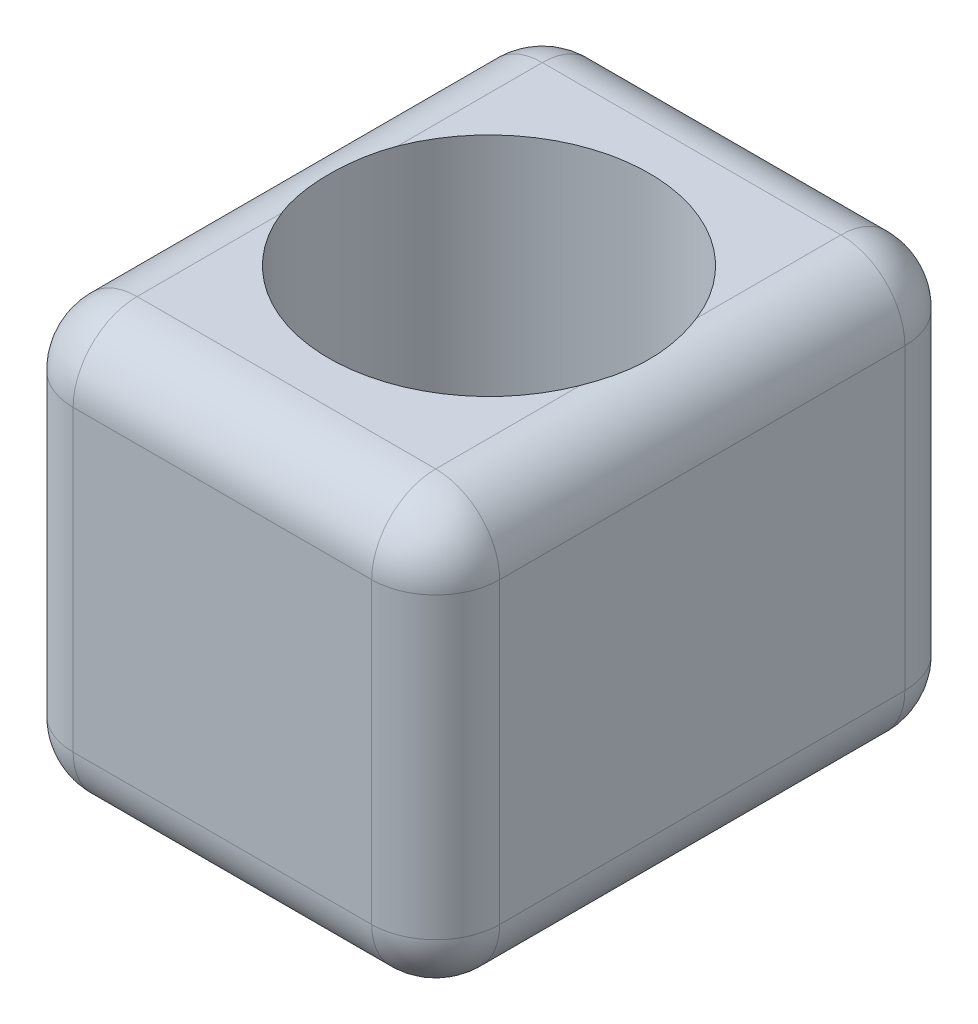
ISO-10303-21;
HEADER;
FILE_DESCRIPTION(('STEP AP214'),'2;1');
FILE_NAME('part.step','',(''),(''),'','','');
FILE_SCHEMA(('AUTOMOTIVE_DESIGN { 1 0 10303 214 1 1 1 1 }'));
ENDSEC;
DATA;
#1=APPLICATION_CONTEXT('core data for automotive mechanical design processes');
#2=APPLICATION_PROTOCOL_DEFINITION('international standard','automotive_design',2000,#1);
#3=PRODUCT_CONTEXT('',#1,'mechanical');
#4=PRODUCT('Part','Part','',(#3));
#5=PRODUCT_RELATED_PRODUCT_CATEGORY('part','',(#4));
#6=PRODUCT_DEFINITION_FORMATION('','',#4);
#7=PRODUCT_DEFINITION_CONTEXT('part definition',#1,'design');
#8=PRODUCT_DEFINITION('design','',#6,#7);
#9=PRODUCT_DEFINITION_SHAPE('','',#8);
#10=(LENGTH_UNIT() NAMED_UNIT(*) SI_UNIT(.MILLI.,.METRE.));
#11=(NAMED_UNIT(*) PLANE_ANGLE_UNIT() SI_UNIT($,.RADIAN.));
#12=(NAMED_UNIT(*) SI_UNIT($,.STERADIAN.) SOLID_ANGLE_UNIT());
#13=UNCERTAINTY_MEASURE_WITH_UNIT(LENGTH_MEASURE(1.E-05),#10,'distance_accuracy_value','');
#14=(GEOMETRIC_REPRESENTATION_CONTEXT(3) GLOBAL_UNCERTAINTY_ASSIGNED_CONTEXT((#13)) GLOBAL_UNIT_ASSIGNED_CONTEXT((#10,
#11,#12)) REPRESENTATION_CONTEXT('',''));
#15=CARTESIAN_POINT('',(0.,0.,0.));
#16=DIRECTION('',(0.,0.,1.));
#17=DIRECTION('',(1.,0.,0.));
#18=AXIS2_PLACEMENT_3D('',#15,#16,#17);
#19=CARTESIAN_POINT('',(-20.,20.,50.));
#20=DIRECTION('',(0.,-1.,0.));
#21=DIRECTION('',(0.,0.,-1.));
#22=AXIS2_PLACEMENT_3D('',#19,#20,#21);
#23=PLANE('',#22);
#24=DIRECTION('',(0.,0.,-1.));
#25=VECTOR('',#24,1.);
#26=CARTESIAN_POINT('',(14.,20.,50.));
#27=LINE('',#26,#25);
#28=CARTESIAN_POINT('',(14.,20.,44.));
#29=VERTEX_POINT('',#28);
#30=CARTESIAN_POINT('',(14.,20.,30.454413350673));
#31=VERTEX_POINT('',#30);
#32=EDGE_CURVE('E46',#29,#31,#27,.T.);
#33=ORIENTED_EDGE('',*,*,#32,.T.);
#34=CARTESIAN_POINT('',(0.,20.,25.));
#35=DIRECTION('',(0.,1.,0.));
#36=DIRECTION('',(0.,0.,1.));
#37=AXIS2_PLACEMENT_3D('',#34,#35,#36);
#38=CIRCLE('',#37,15.025);
#39=CARTESIAN_POINT('',(-14.,20.,30.454413350673));
#40=VERTEX_POINT('',#39);
#41=EDGE_CURVE('E148',#40,#31,#38,.T.);
#42=ORIENTED_EDGE('',*,*,#41,.F.);
#43=DIRECTION('',(0.,0.,-1.));
#44=VECTOR('',#43,1.);
#45=CARTESIAN_POINT('',(-14.,20.,50.));
#46=LINE('',#45,#44);
#47=CARTESIAN_POINT('',(-14.,20.,44.));
#48=VERTEX_POINT('',#47);
#49=EDGE_CURVE('E299',#40,#48,#46,.F.);
#50=ORIENTED_EDGE('',*,*,#49,.T.);
#51=DIRECTION('',(-1.,0.,0.));
#52=VECTOR('',#51,1.);
#53=CARTESIAN_POINT('',(20.,20.,44.));
#54=LINE('',#53,#52);
#55=EDGE_CURVE('E167',#48,#29,#54,.F.);
#56=ORIENTED_EDGE('',*,*,#55,.T.);
#57=EDGE_LOOP('',(#33,#42,#50,#56));
#58=FACE_BOUND('',#57,.T.);
#59=ADVANCED_FACE('F32',(#58),#23,.F.);
#60=CARTESIAN_POINT('',(-20.,-20.,50.));
#61=DIRECTION('',(0.,1.,0.));
#62=DIRECTION('',(0.,0.,1.));
#63=AXIS2_PLACEMENT_3D('',#60,#61,#62);
#64=PLANE('',#63);
#65=DIRECTION('',(0.,0.,-1.));
#66=VECTOR('',#65,1.);
#67=CARTESIAN_POINT('',(14.,-20.,50.));
#68=LINE('',#67,#66);
#69=CARTESIAN_POINT('',(14.,-20.,6.));
#70=VERTEX_POINT('',#69);
#71=CARTESIAN_POINT('',(14.,-20.,19.545586649327));
#72=VERTEX_POINT('',#71);
#73=EDGE_CURVE('E289',#70,#72,#68,.F.);
#74=ORIENTED_EDGE('',*,*,#73,.T.);
#75=CARTESIAN_POINT('',(0.,-20.,25.));
#76=DIRECTION('',(0.,1.,0.));
#77=DIRECTION('',(0.,0.,1.));
#78=AXIS2_PLACEMENT_3D('',#75,#76,#77);
#79=CIRCLE('',#78,15.025);
#80=CARTESIAN_POINT('',(-14.,-20.,19.545586649327));
#81=VERTEX_POINT('',#80);
#82=EDGE_CURVE('E387',#72,#81,#79,.T.);
#83=ORIENTED_EDGE('',*,*,#82,.T.);
#84=DIRECTION('',(0.,0.,-1.));
#85=VECTOR('',#84,1.);
#86=CARTESIAN_POINT('',(-14.,-20.,50.));
#87=LINE('',#86,#85);
#88=CARTESIAN_POINT('',(-14.,-20.,6.));
#89=VERTEX_POINT('',#88);
#90=EDGE_CURVE('E294',#81,#89,#87,.T.);
#91=ORIENTED_EDGE('',*,*,#90,.T.);
#92=DIRECTION('',(1.,0.,0.));
#93=VECTOR('',#92,1.);
#94=CARTESIAN_POINT('',(-20.,-20.,6.));
#95=LINE('',#94,#93);
#96=EDGE_CURVE('E286',#89,#70,#95,.T.);
#97=ORIENTED_EDGE('',*,*,#96,.T.);
#98=EDGE_LOOP('',(#74,#83,#91,#97));
#99=FACE_BOUND('',#98,.T.);
#100=ADVANCED_FACE('F416',(#99),#64,.F.);
#101=CARTESIAN_POINT('',(20.,20.,50.));
#102=DIRECTION('',(-1.,0.,0.));
#103=DIRECTION('',(0.,-1.,0.));
#104=AXIS2_PLACEMENT_3D('',#101,#102,#103);
#105=PLANE('',#104);
#106=DIRECTION('',(0.,1.,0.));
#107=VECTOR('',#106,1.);
#108=CARTESIAN_POINT('',(20.,-20.,44.));
#109=LINE('',#108,#107);
#110=CARTESIAN_POINT('',(20.,14.,44.));
#111=VERTEX_POINT('',#110);
#112=CARTESIAN_POINT('',(20.,-14.,44.));
#113=VERTEX_POINT('',#112);
#114=EDGE_CURVE('E270',#111,#113,#109,.F.);
#115=ORIENTED_EDGE('',*,*,#114,.T.);
#116=DIRECTION('',(0.,0.,-1.));
#117=VECTOR('',#116,1.);
#118=CARTESIAN_POINT('',(20.,-14.,50.));
#119=LINE('',#118,#117);
#120=CARTESIAN_POINT('',(20.,-14.,6.));
#121=VERTEX_POINT('',#120);
#122=EDGE_CURVE('E275',#113,#121,#119,.T.);
#123=ORIENTED_EDGE('',*,*,#122,.T.);
#124=DIRECTION('',(0.,1.,0.));
#125=VECTOR('',#124,1.);
#126=CARTESIAN_POINT('',(20.,20.,6.));
#127=LINE('',#126,#125);
#128=CARTESIAN_POINT('',(20.,14.,6.));
#129=VERTEX_POINT('',#128);
#130=EDGE_CURVE('E272',#121,#129,#127,.T.);
#131=ORIENTED_EDGE('',*,*,#130,.T.);
#132=DIRECTION('',(0.,0.,-1.));
#133=VECTOR('',#132,1.);
#134=CARTESIAN_POINT('',(20.,14.,50.));
#135=LINE('',#134,#133);
#136=EDGE_CURVE('E268',#129,#111,#135,.F.);
#137=ORIENTED_EDGE('',*,*,#136,.T.);
#138=EDGE_LOOP('',(#115,#123,#131,#137));
#139=FACE_BOUND('',#138,.T.);
#140=ADVANCED_FACE('F358',(#139),#105,.F.);
#141=CARTESIAN_POINT('',(-14.,20.,6.));
#142=VERTEX_POINT('',#141);
#143=CARTESIAN_POINT('',(-14.,20.,19.545586649327));
#144=VERTEX_POINT('',#143);
#145=EDGE_CURVE('E300',#142,#144,#46,.F.);
#146=ORIENTED_EDGE('',*,*,#145,.T.);
#147=CARTESIAN_POINT('',(14.,20.,19.545586649327));
#148=VERTEX_POINT('',#147);
#149=EDGE_CURVE('E53',#148,#144,#38,.T.);
#150=ORIENTED_EDGE('',*,*,#149,.F.);
#151=CARTESIAN_POINT('',(14.,20.,6.));
#152=VERTEX_POINT('',#151);
#153=EDGE_CURVE('E163',#148,#152,#27,.T.);
#154=ORIENTED_EDGE('',*,*,#153,.T.);
#155=DIRECTION('',(-1.,0.,0.));
#156=VECTOR('',#155,1.);
#157=CARTESIAN_POINT('',(-20.,20.,6.));
#158=LINE('',#157,#156);
#159=EDGE_CURVE('E298',#152,#142,#158,.T.);
#160=ORIENTED_EDGE('',*,*,#159,.T.);
#161=EDGE_LOOP('',(#146,#150,#154,#160));
#162=FACE_BOUND('',#161,.T.);
#163=ADVANCED_FACE('F386',(#162),#23,.F.);
#164=CARTESIAN_POINT('',(-20.,20.,50.));
#165=DIRECTION('',(1.,0.,0.));
#166=DIRECTION('',(0.,1.,0.));
#167=AXIS2_PLACEMENT_3D('',#164,#165,#166);
#168=PLANE('',#167);
#169=DIRECTION('',(0.,-1.,0.));
#170=VECTOR('',#169,1.);
#171=CARTESIAN_POINT('',(-20.,20.,6.));
#172=LINE('',#171,#170);
#173=CARTESIAN_POINT('',(-20.,14.,6.));
#174=VERTEX_POINT('',#173);
#175=CARTESIAN_POINT('',(-20.,-14.,6.));
#176=VERTEX_POINT('',#175);
#177=EDGE_CURVE('E247',#174,#176,#172,.T.);
#178=ORIENTED_EDGE('',*,*,#177,.T.);
#179=DIRECTION('',(0.,0.,-1.));
#180=VECTOR('',#179,1.);
#181=CARTESIAN_POINT('',(-20.,-14.,50.));
#182=LINE('',#181,#180);
#183=CARTESIAN_POINT('',(-20.,-14.,44.));
#184=VERTEX_POINT('',#183);
#185=EDGE_CURVE('E257',#176,#184,#182,.F.);
#186=ORIENTED_EDGE('',*,*,#185,.T.);
#187=DIRECTION('',(0.,-1.,0.));
#188=VECTOR('',#187,1.);
#189=CARTESIAN_POINT('',(-20.,20.,44.));
#190=LINE('',#189,#188);
#191=CARTESIAN_POINT('',(-20.,14.,44.));
#192=VERTEX_POINT('',#191);
#193=EDGE_CURVE('E241',#184,#192,#190,.F.);
#194=ORIENTED_EDGE('',*,*,#193,.T.);
#195=DIRECTION('',(0.,0.,-1.));
#196=VECTOR('',#195,1.);
#197=CARTESIAN_POINT('',(-20.,14.,50.));
#198=LINE('',#197,#196);
#199=EDGE_CURVE('E236',#192,#174,#198,.T.);
#200=ORIENTED_EDGE('',*,*,#199,.T.);
#201=EDGE_LOOP('',(#178,#186,#194,#200));
#202=FACE_BOUND('',#201,.T.);
#203=ADVANCED_FACE('F324',(#202),#168,.F.);
#204=CARTESIAN_POINT('',(-14.,-20.,44.));
#205=VERTEX_POINT('',#204);
#206=CARTESIAN_POINT('',(-14.,-20.,30.454413350673));
#207=VERTEX_POINT('',#206);
#208=EDGE_CURVE('E295',#205,#207,#87,.T.);
#209=ORIENTED_EDGE('',*,*,#208,.T.);
#210=CARTESIAN_POINT('',(14.,-20.,30.454413350673));
#211=VERTEX_POINT('',#210);
#212=EDGE_CURVE('E60',#207,#211,#79,.T.);
#213=ORIENTED_EDGE('',*,*,#212,.T.);
#214=CARTESIAN_POINT('',(14.,-20.,44.));
#215=VERTEX_POINT('',#214);
#216=EDGE_CURVE('E288',#211,#215,#68,.F.);
#217=ORIENTED_EDGE('',*,*,#216,.T.);
#218=DIRECTION('',(1.,0.,0.));
#219=VECTOR('',#218,1.);
#220=CARTESIAN_POINT('',(-20.,-20.,44.));
#221=LINE('',#220,#219);
#222=EDGE_CURVE('E292',#215,#205,#221,.F.);
#223=ORIENTED_EDGE('',*,*,#222,.T.);
#224=EDGE_LOOP('',(#209,#213,#217,#223));
#225=FACE_BOUND('',#224,.T.);
#226=ADVANCED_FACE('F342',(#225),#64,.F.);
#227=CARTESIAN_POINT('',(0.,0.,50.));
#228=DIRECTION('',(0.,0.,1.));
#229=DIRECTION('',(1.,0.,0.));
#230=AXIS2_PLACEMENT_3D('',#227,#228,#229);
#231=PLANE('',#230);
#232=DIRECTION('',(0.,-1.,0.));
#233=VECTOR('',#232,1.);
#234=CARTESIAN_POINT('',(-14.,-20.,50.));
#235=LINE('',#234,#233);
#236=CARTESIAN_POINT('',(-14.,14.,50.));
#237=VERTEX_POINT('',#236);
#238=CARTESIAN_POINT('',(-14.,-14.,50.));
#239=VERTEX_POINT('',#238);
#240=EDGE_CURVE('E281',#237,#239,#235,.T.);
#241=ORIENTED_EDGE('',*,*,#240,.T.);
#242=DIRECTION('',(1.,0.,0.));
#243=VECTOR('',#242,1.);
#244=CARTESIAN_POINT('',(20.,-14.,50.));
#245=LINE('',#244,#243);
#246=CARTESIAN_POINT('',(14.,-14.,50.));
#247=VERTEX_POINT('',#246);
#248=EDGE_CURVE('E284',#239,#247,#245,.T.);
#249=ORIENTED_EDGE('',*,*,#248,.T.);
#250=DIRECTION('',(0.,1.,0.));
#251=VECTOR('',#250,1.);
#252=CARTESIAN_POINT('',(14.,20.,50.));
#253=LINE('',#252,#251);
#254=CARTESIAN_POINT('',(14.,14.,50.));
#255=VERTEX_POINT('',#254);
#256=EDGE_CURVE('E279',#247,#255,#253,.T.);
#257=ORIENTED_EDGE('',*,*,#256,.T.);
#258=DIRECTION('',(-1.,0.,0.));
#259=VECTOR('',#258,1.);
#260=CARTESIAN_POINT('',(-20.,14.,50.));
#261=LINE('',#260,#259);
#262=EDGE_CURVE('E277',#255,#237,#261,.T.);
#263=ORIENTED_EDGE('',*,*,#262,.T.);
#264=EDGE_LOOP('',(#241,#249,#257,#263));
#265=FACE_BOUND('',#264,.T.);
#266=ADVANCED_FACE('F350',(#265),#231,.T.);
#267=CARTESIAN_POINT('',(0.,0.,0.));
#268=DIRECTION('',(0.,0.,1.));
#269=DIRECTION('',(1.,0.,0.));
#270=AXIS2_PLACEMENT_3D('',#267,#268,#269);
#271=PLANE('',#270);
#272=DIRECTION('',(0.,1.,0.));
#273=VECTOR('',#272,1.);
#274=CARTESIAN_POINT('',(14.,0.,0.));
#275=LINE('',#274,#273);
#276=CARTESIAN_POINT('',(14.,14.,0.));
#277=VERTEX_POINT('',#276);
#278=CARTESIAN_POINT('',(14.,-14.,0.));
#279=VERTEX_POINT('',#278);
#280=EDGE_CURVE('E261',#277,#279,#275,.F.);
#281=ORIENTED_EDGE('',*,*,#280,.T.);
#282=DIRECTION('',(1.,0.,0.));
#283=VECTOR('',#282,1.);
#284=CARTESIAN_POINT('',(0.,-14.,0.));
#285=LINE('',#284,#283);
#286=CARTESIAN_POINT('',(-14.,-14.,0.));
#287=VERTEX_POINT('',#286);
#288=EDGE_CURVE('E266',#279,#287,#285,.F.);
#289=ORIENTED_EDGE('',*,*,#288,.T.);
#290=DIRECTION('',(0.,-1.,0.));
#291=VECTOR('',#290,1.);
#292=CARTESIAN_POINT('',(-14.,0.,0.));
#293=LINE('',#292,#291);
#294=CARTESIAN_POINT('',(-14.,14.,0.));
#295=VERTEX_POINT('',#294);
#296=EDGE_CURVE('E263',#287,#295,#293,.F.);
#297=ORIENTED_EDGE('',*,*,#296,.T.);
#298=DIRECTION('',(-1.,0.,0.));
#299=VECTOR('',#298,1.);
#300=CARTESIAN_POINT('',(0.,14.,0.));
#301=LINE('',#300,#299);
#302=EDGE_CURVE('E259',#295,#277,#301,.F.);
#303=ORIENTED_EDGE('',*,*,#302,.T.);
#304=EDGE_LOOP('',(#281,#289,#297,#303));
#305=FACE_BOUND('',#304,.T.);
#306=ADVANCED_FACE('F379',(#305),#271,.F.);
#307=CARTESIAN_POINT('',(14.,0.,44.));
#308=DIRECTION('',(0.,-1.,0.));
#309=DIRECTION('',(1.,0.,0.));
#310=AXIS2_PLACEMENT_3D('',#307,#308,#309);
#311=CYLINDRICAL_SURFACE('',#310,6.);
#312=CARTESIAN_POINT('',(14.,14.,44.));
#313=DIRECTION('',(0.,1.,0.));
#314=DIRECTION('',(0.,0.,1.));
#315=AXIS2_PLACEMENT_3D('',#312,#313,#314);
#316=CIRCLE('',#315,6.);
#317=EDGE_CURVE('E234',#255,#111,#316,.T.);
#318=ORIENTED_EDGE('',*,*,#317,.F.);
#319=ORIENTED_EDGE('',*,*,#256,.F.);
#320=CARTESIAN_POINT('',(14.,-14.,44.));
#321=DIRECTION('',(0.,-1.,0.));
#322=DIRECTION('',(0.,0.,-1.));
#323=AXIS2_PLACEMENT_3D('',#320,#321,#322);
#324=CIRCLE('',#323,6.);
#325=EDGE_CURVE('E232',#113,#247,#324,.T.);
#326=ORIENTED_EDGE('',*,*,#325,.F.);
#327=ORIENTED_EDGE('',*,*,#114,.F.);
#328=EDGE_LOOP('',(#318,#319,#326,#327));
#329=FACE_BOUND('',#328,.T.);
#330=ADVANCED_FACE('F34',(#329),#311,.T.);
#331=CARTESIAN_POINT('',(14.,14.,44.));
#332=DIRECTION('',(0.,0.,1.));
#333=DIRECTION('',(1.,0.,0.));
#334=AXIS2_PLACEMENT_3D('',#331,#332,#333);
#335=SPHERICAL_SURFACE('',#334,6.);
#336=CARTESIAN_POINT('',(14.,14.,44.));
#337=DIRECTION('',(1.,0.,0.));
#338=DIRECTION('',(0.,0.,-1.));
#339=AXIS2_PLACEMENT_3D('',#336,#337,#338);
#340=CIRCLE('',#339,6.);
#341=EDGE_CURVE('E228',#255,#29,#340,.F.);
#342=ORIENTED_EDGE('',*,*,#341,.F.);
#343=ORIENTED_EDGE('',*,*,#317,.T.);
#344=CARTESIAN_POINT('',(14.,14.,44.));
#345=DIRECTION('',(0.,0.,1.));
#346=DIRECTION('',(1.,0.,0.));
#347=AXIS2_PLACEMENT_3D('',#344,#345,#346);
#348=CIRCLE('',#347,6.);
#349=EDGE_CURVE('E230',#29,#111,#348,.F.);
#350=ORIENTED_EDGE('',*,*,#349,.F.);
#351=EDGE_LOOP('',(#342,#343,#350));
#352=FACE_BOUND('',#351,.T.);
#353=ADVANCED_FACE('F354',(#352),#335,.T.);
#354=CARTESIAN_POINT('',(14.,-14.,44.));
#355=DIRECTION('',(0.,0.,1.));
#356=DIRECTION('',(1.,0.,0.));
#357=AXIS2_PLACEMENT_3D('',#354,#355,#356);
#358=SPHERICAL_SURFACE('',#357,6.);
#359=CARTESIAN_POINT('',(14.,-14.,44.));
#360=DIRECTION('',(0.,0.,1.));
#361=DIRECTION('',(1.,0.,0.));
#362=AXIS2_PLACEMENT_3D('',#359,#360,#361);
#363=CIRCLE('',#362,6.);
#364=EDGE_CURVE('E222',#113,#215,#363,.F.);
#365=ORIENTED_EDGE('',*,*,#364,.F.);
#366=ORIENTED_EDGE('',*,*,#325,.T.);
#367=CARTESIAN_POINT('',(14.,-14.,44.));
#368=DIRECTION('',(1.,0.,0.));
#369=DIRECTION('',(0.,0.,-1.));
#370=AXIS2_PLACEMENT_3D('',#367,#368,#369);
#371=CIRCLE('',#370,6.);
#372=EDGE_CURVE('E225',#215,#247,#371,.F.);
#373=ORIENTED_EDGE('',*,*,#372,.F.);
#374=EDGE_LOOP('',(#365,#366,#373));
#375=FACE_BOUND('',#374,.T.);
#376=ADVANCED_FACE('F460',(#375),#358,.T.);
#377=CARTESIAN_POINT('',(14.,14.,50.));
#378=DIRECTION('',(0.,0.,-1.));
#379=DIRECTION('',(-1.,0.,0.));
#380=AXIS2_PLACEMENT_3D('',#377,#378,#379);
#381=CYLINDRICAL_SURFACE('',#380,6.);
#382=CARTESIAN_POINT('',(14.,20.,30.454413350673));
#383=CARTESIAN_POINT('',(14.0760092012328,19.9999842305679,30.2593254485294));
#384=CARTESIAN_POINT('',(14.1479316876915,19.9985554117616,30.0626575041769));
#385=CARTESIAN_POINT('',(14.2834873087101,19.9936869826131,29.6665209736521));
#386=CARTESIAN_POINT('',(14.3471209162839,19.9902474870738,29.4670525480126));
#387=CARTESIAN_POINT('',(14.4659949720803,19.9821725920524,29.0656406261245));
#388=CARTESIAN_POINT('',(14.5212349384884,19.9775371239598,28.8636969885116));
#389=CARTESIAN_POINT('',(14.6232263971601,19.9677635525122,28.4577013379903));
#390=CARTESIAN_POINT('',(14.6699777721975,19.9626254422174,28.2536492960064));
#391=CARTESIAN_POINT('',(14.7974201873639,19.9473993133885,27.6386124316186));
#392=CARTESIAN_POINT('',(14.8652607362354,19.9375029652585,27.2248778722397));
#393=CARTESIAN_POINT('',(14.9661320118981,19.9219236905719,26.3932026544072));
#394=CARTESIAN_POINT('',(14.9991666628062,19.916240289057,25.9752624754722));
#395=CARTESIAN_POINT('',(15.0302984368485,19.9109010222702,25.1354724107776));
#396=CARTESIAN_POINT('',(15.0281813637576,19.911282110241,24.7136142222565));
#397=CARTESIAN_POINT('',(14.988492373629,19.9180469930768,23.8715367566737));
#398=CARTESIAN_POINT('',(14.9509132403302,19.9244320096951,23.4513178306664));
#399=CARTESIAN_POINT('',(14.840715968283,19.9410669212575,22.6165924116631));
#400=CARTESIAN_POINT('',(14.7681789339336,19.9513078582685,22.2020749691575));
#401=CARTESIAN_POINT('',(14.5886349374909,19.9717394096411,21.3807621484638));
#402=CARTESIAN_POINT('',(14.4816484043313,19.9819300502016,20.9739623446491));
#403=CARTESIAN_POINT('',(14.3043815749098,19.9925104378927,20.3991067964761));
#404=CARTESIAN_POINT('',(14.2478016303004,19.995178653822,20.2267749095575));
#405=CARTESIAN_POINT('',(14.128497969238,19.9989198379511,19.884437444847));
#406=CARTESIAN_POINT('',(14.0657807701204,19.9999944792335,19.7144296131731));
#407=CARTESIAN_POINT('',(14.,20.,19.545586649327));
#408=B_SPLINE_CURVE_WITH_KNOTS('',3,(#382,#383,#384,#385,#386,#387,#388,#389,#390,#391,#392,
#393,#394,#395,#396,#397,#398,#399,#400,#401,#402,#403,#404,#405,#406,#407),.UNSPECIFIED.,.F.,
.F.,(4,2,2,2,2,2,2,2,2,2,2,2,4),(0.,0.628049059158933,1.25606226229853,1.88411150124768,
2.51216941280842,3.76869395342045,5.02507681468211,6.28911821073012,7.55341688512384,
8.81479633039637,10.0754291370592,10.6195312965081,11.1630618015482),.UNSPECIFIED.);
#409=EDGE_CURVE('E151',#31,#148,#408,.T.);
#410=ORIENTED_EDGE('',*,*,#409,.F.);
#411=ORIENTED_EDGE('',*,*,#32,.F.);
#412=ORIENTED_EDGE('',*,*,#349,.T.);
#413=ORIENTED_EDGE('',*,*,#136,.F.);
#414=CARTESIAN_POINT('',(14.,14.,6.));
#415=DIRECTION('',(0.,0.,-1.));
#416=DIRECTION('',(-1.,0.,0.));
#417=AXIS2_PLACEMENT_3D('',#414,#415,#416);
#418=CIRCLE('',#417,6.);
#419=EDGE_CURVE('E217',#152,#129,#418,.T.);
#420=ORIENTED_EDGE('',*,*,#419,.F.);
#421=ORIENTED_EDGE('',*,*,#153,.F.);
#422=EDGE_LOOP('',(#410,#411,#412,#413,#420,#421));
#423=FACE_BOUND('',#422,.T.);
#424=ADVANCED_FACE('F160',(#423),#381,.T.);
#425=CARTESIAN_POINT('',(0.,14.,44.));
#426=DIRECTION('',(1.,0.,0.));
#427=DIRECTION('',(0.,0.,-1.));
#428=AXIS2_PLACEMENT_3D('',#425,#426,#427);
#429=CYLINDRICAL_SURFACE('',#428,6.);
#430=ORIENTED_EDGE('',*,*,#341,.T.);
#431=ORIENTED_EDGE('',*,*,#55,.F.);
#432=CARTESIAN_POINT('',(-14.,14.,44.));
#433=DIRECTION('',(-1.,0.,0.));
#434=DIRECTION('',(0.,0.,1.));
#435=AXIS2_PLACEMENT_3D('',#432,#433,#434);
#436=CIRCLE('',#435,6.);
#437=EDGE_CURVE('E214',#237,#48,#436,.T.);
#438=ORIENTED_EDGE('',*,*,#437,.F.);
#439=ORIENTED_EDGE('',*,*,#262,.F.);
#440=EDGE_LOOP('',(#430,#431,#438,#439));
#441=FACE_BOUND('',#440,.T.);
#442=ADVANCED_FACE('F307',(#441),#429,.T.);
#443=CARTESIAN_POINT('',(-14.,0.,44.));
#444=DIRECTION('',(0.,1.,0.));
#445=DIRECTION('',(-1.,0.,0.));
#446=AXIS2_PLACEMENT_3D('',#443,#444,#445);
#447=CYLINDRICAL_SURFACE('',#446,6.);
#448=CARTESIAN_POINT('',(-14.,-14.,44.));
#449=DIRECTION('',(0.,-1.,0.));
#450=DIRECTION('',(0.,0.,-1.));
#451=AXIS2_PLACEMENT_3D('',#448,#449,#450);
#452=CIRCLE('',#451,6.);
#453=EDGE_CURVE('E208',#239,#184,#452,.T.);
#454=ORIENTED_EDGE('',*,*,#453,.F.);
#455=ORIENTED_EDGE('',*,*,#240,.F.);
#456=CARTESIAN_POINT('',(-14.,14.,44.));
#457=DIRECTION('',(0.,1.,0.));
#458=DIRECTION('',(0.,0.,1.));
#459=AXIS2_PLACEMENT_3D('',#456,#457,#458);
#460=CIRCLE('',#459,6.);
#461=EDGE_CURVE('E211',#192,#237,#460,.T.);
#462=ORIENTED_EDGE('',*,*,#461,.F.);
#463=ORIENTED_EDGE('',*,*,#193,.F.);
#464=EDGE_LOOP('',(#454,#455,#462,#463));
#465=FACE_BOUND('',#464,.T.);
#466=ADVANCED_FACE('F331',(#465),#447,.T.);
#467=CARTESIAN_POINT('',(0.,-14.,44.));
#468=DIRECTION('',(-1.,0.,0.));
#469=DIRECTION('',(0.,0.,1.));
#470=AXIS2_PLACEMENT_3D('',#467,#468,#469);
#471=CYLINDRICAL_SURFACE('',#470,6.);
#472=ORIENTED_EDGE('',*,*,#372,.T.);
#473=ORIENTED_EDGE('',*,*,#248,.F.);
#474=CARTESIAN_POINT('',(-14.,-14.,44.));
#475=DIRECTION('',(-1.,0.,0.));
#476=DIRECTION('',(0.,0.,1.));
#477=AXIS2_PLACEMENT_3D('',#474,#475,#476);
#478=CIRCLE('',#477,6.);
#479=EDGE_CURVE('E206',#205,#239,#478,.T.);
#480=ORIENTED_EDGE('',*,*,#479,.F.);
#481=ORIENTED_EDGE('',*,*,#222,.F.);
#482=EDGE_LOOP('',(#472,#473,#480,#481));
#483=FACE_BOUND('',#482,.T.);
#484=ADVANCED_FACE('F346',(#483),#471,.T.);
#485=CARTESIAN_POINT('',(14.,-14.,50.));
#486=DIRECTION('',(0.,0.,-1.));
#487=DIRECTION('',(-1.,0.,0.));
#488=AXIS2_PLACEMENT_3D('',#485,#486,#487);
#489=CYLINDRICAL_SURFACE('',#488,6.);
#490=CARTESIAN_POINT('',(14.,-20.,19.545586649327));
#491=CARTESIAN_POINT('',(14.0760092012328,-19.9999842305679,19.7406745514706));
#492=CARTESIAN_POINT('',(14.1479316876915,-19.9985554117616,19.9373424958231));
#493=CARTESIAN_POINT('',(14.2834873087101,-19.9936869826131,20.3334790263479));
#494=CARTESIAN_POINT('',(14.3471209162839,-19.9902474870739,20.5329474519874));
#495=CARTESIAN_POINT('',(14.4659949720803,-19.9821725920524,20.9343593738755));
#496=CARTESIAN_POINT('',(14.5212349384884,-19.9775371239598,21.1363030114884));
#497=CARTESIAN_POINT('',(14.6232263971601,-19.9677635525122,21.5422986620097));
#498=CARTESIAN_POINT('',(14.6699777721975,-19.9626254422174,21.7463507039936));
#499=CARTESIAN_POINT('',(14.7974201873639,-19.9473993133885,22.3613875683814));
#500=CARTESIAN_POINT('',(14.8652607362354,-19.9375029652585,22.7751221277603));
#501=CARTESIAN_POINT('',(14.9661320118981,-19.9219236905719,23.6067973455928));
#502=CARTESIAN_POINT('',(14.9991666628062,-19.916240289057,24.0247375245278));
#503=CARTESIAN_POINT('',(15.0302984368485,-19.9109010222703,24.8645275892224));
#504=CARTESIAN_POINT('',(15.0281813637576,-19.911282110241,25.2863857777435));
#505=CARTESIAN_POINT('',(14.988492373629,-19.9180469930768,26.1284632433263));
#506=CARTESIAN_POINT('',(14.9509132403302,-19.9244320096951,26.5486821693336));
#507=CARTESIAN_POINT('',(14.840715968283,-19.9410669212575,27.3834075883369));
#508=CARTESIAN_POINT('',(14.7681789339336,-19.9513078582685,27.7979250308425));
#509=CARTESIAN_POINT('',(14.5886349374909,-19.9717394096411,28.6192378515362));
#510=CARTESIAN_POINT('',(14.4816484043313,-19.9819300502016,29.0260376553509));
#511=CARTESIAN_POINT('',(14.3043815749098,-19.9925104378927,29.6008932035239));
#512=CARTESIAN_POINT('',(14.2478016303004,-19.995178653822,29.7732250904425));
#513=CARTESIAN_POINT('',(14.128497969238,-19.9989198379511,30.115562555153));
#514=CARTESIAN_POINT('',(14.0657807701204,-19.9999944792335,30.2855703868269));
#515=CARTESIAN_POINT('',(14.,-20.,30.454413350673));
#516=B_SPLINE_CURVE_WITH_KNOTS('',3,(#490,#491,#492,#493,#494,#495,#496,#497,#498,#499,#500,
#501,#502,#503,#504,#505,#506,#507,#508,#509,#510,#511,#512,#513,#514,#515),.UNSPECIFIED.,.F.,
.F.,(4,2,2,2,2,2,2,2,2,2,2,2,4),(0.,0.628049059158934,1.25606226229853,1.88411150124767,
2.51216941280842,3.76869395342045,5.02507681468211,6.28911821073012,7.55341688512384,
8.81479633039637,10.0754291370592,10.6195312965081,11.1630618015482),.UNSPECIFIED.);
#517=EDGE_CURVE('E390',#72,#211,#516,.T.);
#518=ORIENTED_EDGE('',*,*,#517,.F.);
#519=ORIENTED_EDGE('',*,*,#73,.F.);
#520=CARTESIAN_POINT('',(14.,-14.,6.));
#521=DIRECTION('',(0.,0.,-1.));
#522=DIRECTION('',(-1.,0.,0.));
#523=AXIS2_PLACEMENT_3D('',#520,#521,#522);
#524=CIRCLE('',#523,6.);
#525=EDGE_CURVE('E203',#121,#70,#524,.T.);
#526=ORIENTED_EDGE('',*,*,#525,.F.);
#527=ORIENTED_EDGE('',*,*,#122,.F.);
#528=ORIENTED_EDGE('',*,*,#364,.T.);
#529=ORIENTED_EDGE('',*,*,#216,.F.);
#530=EDGE_LOOP('',(#518,#519,#526,#527,#528,#529));
#531=FACE_BOUND('',#530,.T.);
#532=ADVANCED_FACE('F370',(#531),#489,.T.);
#533=CARTESIAN_POINT('',(14.,20.,6.));
#534=DIRECTION('',(0.,1.,0.));
#535=DIRECTION('',(-1.,0.,0.));
#536=AXIS2_PLACEMENT_3D('',#533,#534,#535);
#537=CYLINDRICAL_SURFACE('',#536,6.);
#538=CARTESIAN_POINT('',(14.,14.,6.));
#539=DIRECTION('',(0.,1.,0.));
#540=DIRECTION('',(0.,0.,1.));
#541=AXIS2_PLACEMENT_3D('',#538,#539,#540);
#542=CIRCLE('',#541,6.);
#543=EDGE_CURVE('E219',#129,#277,#542,.T.);
#544=ORIENTED_EDGE('',*,*,#543,.F.);
#545=ORIENTED_EDGE('',*,*,#130,.F.);
#546=CARTESIAN_POINT('',(14.,-14.,6.));
#547=DIRECTION('',(0.,-1.,0.));
#548=DIRECTION('',(1.,0.,0.));
#549=AXIS2_PLACEMENT_3D('',#546,#547,#548);
#550=CIRCLE('',#549,6.);
#551=EDGE_CURVE('E200',#279,#121,#550,.T.);
#552=ORIENTED_EDGE('',*,*,#551,.F.);
#553=ORIENTED_EDGE('',*,*,#280,.F.);
#554=EDGE_LOOP('',(#544,#545,#552,#553));
#555=FACE_BOUND('',#554,.T.);
#556=ADVANCED_FACE('F364',(#555),#537,.T.);
#557=CARTESIAN_POINT('',(14.,14.,6.));
#558=DIRECTION('',(0.,0.,1.));
#559=DIRECTION('',(1.,0.,0.));
#560=AXIS2_PLACEMENT_3D('',#557,#558,#559);
#561=SPHERICAL_SURFACE('',#560,6.);
#562=ORIENTED_EDGE('',*,*,#419,.T.);
#563=ORIENTED_EDGE('',*,*,#543,.T.);
#564=CARTESIAN_POINT('',(14.,14.,6.));
#565=DIRECTION('',(1.,0.,0.));
#566=DIRECTION('',(0.,1.,0.));
#567=AXIS2_PLACEMENT_3D('',#564,#565,#566);
#568=CIRCLE('',#567,6.);
#569=EDGE_CURVE('E197',#152,#277,#568,.F.);
#570=ORIENTED_EDGE('',*,*,#569,.F.);
#571=EDGE_LOOP('',(#562,#563,#570));
#572=FACE_BOUND('',#571,.T.);
#573=ADVANCED_FACE('F382',(#572),#561,.T.);
#574=CARTESIAN_POINT('',(-14.,14.,44.));
#575=DIRECTION('',(0.,0.,1.));
#576=DIRECTION('',(1.,0.,0.));
#577=AXIS2_PLACEMENT_3D('',#574,#575,#576);
#578=SPHERICAL_SURFACE('',#577,6.);
#579=ORIENTED_EDGE('',*,*,#461,.T.);
#580=ORIENTED_EDGE('',*,*,#437,.T.);
#581=CARTESIAN_POINT('',(-14.,14.,44.));
#582=DIRECTION('',(0.,0.,1.));
#583=DIRECTION('',(1.,0.,0.));
#584=AXIS2_PLACEMENT_3D('',#581,#582,#583);
#585=CIRCLE('',#584,6.);
#586=EDGE_CURVE('E194',#192,#48,#585,.F.);
#587=ORIENTED_EDGE('',*,*,#586,.F.);
#588=EDGE_LOOP('',(#579,#580,#587));
#589=FACE_BOUND('',#588,.T.);
#590=ADVANCED_FACE('F311',(#589),#578,.T.);
#591=CARTESIAN_POINT('',(-14.,-14.,44.));
#592=DIRECTION('',(0.,0.,1.));
#593=DIRECTION('',(1.,0.,0.));
#594=AXIS2_PLACEMENT_3D('',#591,#592,#593);
#595=SPHERICAL_SURFACE('',#594,6.);
#596=ORIENTED_EDGE('',*,*,#479,.T.);
#597=ORIENTED_EDGE('',*,*,#453,.T.);
#598=CARTESIAN_POINT('',(-14.,-14.,44.));
#599=DIRECTION('',(0.,0.,1.));
#600=DIRECTION('',(1.,0.,0.));
#601=AXIS2_PLACEMENT_3D('',#598,#599,#600);
#602=CIRCLE('',#601,6.);
#603=EDGE_CURVE('E191',#205,#184,#602,.F.);
#604=ORIENTED_EDGE('',*,*,#603,.F.);
#605=EDGE_LOOP('',(#596,#597,#604));
#606=FACE_BOUND('',#605,.T.);
#607=ADVANCED_FACE('F336',(#606),#595,.T.);
#608=CARTESIAN_POINT('',(14.,-14.,6.));
#609=DIRECTION('',(0.,0.,1.));
#610=DIRECTION('',(1.,0.,0.));
#611=AXIS2_PLACEMENT_3D('',#608,#609,#610);
#612=SPHERICAL_SURFACE('',#611,6.);
#613=ORIENTED_EDGE('',*,*,#551,.T.);
#614=ORIENTED_EDGE('',*,*,#525,.T.);
#615=CARTESIAN_POINT('',(14.,-14.,6.));
#616=DIRECTION('',(1.,0.,0.));
#617=DIRECTION('',(0.,0.,-1.));
#618=AXIS2_PLACEMENT_3D('',#615,#616,#617);
#619=CIRCLE('',#618,6.);
#620=EDGE_CURVE('E188',#279,#70,#619,.F.);
#621=ORIENTED_EDGE('',*,*,#620,.F.);
#622=EDGE_LOOP('',(#613,#614,#621));
#623=FACE_BOUND('',#622,.T.);
#624=ADVANCED_FACE('F372',(#623),#612,.T.);
#625=CARTESIAN_POINT('',(-20.,14.,6.));
#626=DIRECTION('',(-1.,0.,0.));
#627=DIRECTION('',(0.,0.,1.));
#628=AXIS2_PLACEMENT_3D('',#625,#626,#627);
#629=CYLINDRICAL_SURFACE('',#628,6.);
#630=ORIENTED_EDGE('',*,*,#569,.T.);
#631=ORIENTED_EDGE('',*,*,#302,.F.);
#632=CARTESIAN_POINT('',(-14.,14.,6.));
#633=DIRECTION('',(-1.,0.,0.));
#634=DIRECTION('',(0.,0.,1.));
#635=AXIS2_PLACEMENT_3D('',#632,#633,#634);
#636=CIRCLE('',#635,6.);
#637=EDGE_CURVE('E185',#142,#295,#636,.T.);
#638=ORIENTED_EDGE('',*,*,#637,.F.);
#639=ORIENTED_EDGE('',*,*,#159,.F.);
#640=EDGE_LOOP('',(#630,#631,#638,#639));
#641=FACE_BOUND('',#640,.T.);
#642=ADVANCED_FACE('F385',(#641),#629,.T.);
#643=CARTESIAN_POINT('',(-14.,14.,50.));
#644=DIRECTION('',(0.,0.,-1.));
#645=DIRECTION('',(-1.,0.,0.));
#646=AXIS2_PLACEMENT_3D('',#643,#644,#645);
#647=CYLINDRICAL_SURFACE('',#646,6.);
#648=CARTESIAN_POINT('',(-14.,20.,19.545586649327));
#649=CARTESIAN_POINT('',(-14.0760092012328,19.9999842305679,19.7406745514706));
#650=CARTESIAN_POINT('',(-14.1479316876915,19.9985554117616,19.9373424958231));
#651=CARTESIAN_POINT('',(-14.2834873087101,19.9936869826131,20.3334790263479));
#652=CARTESIAN_POINT('',(-14.3471209162839,19.9902474870738,20.5329474519874));
#653=CARTESIAN_POINT('',(-14.4659949720803,19.9821725920524,20.9343593738755));
#654=CARTESIAN_POINT('',(-14.5212349384884,19.9775371239598,21.1363030114884));
#655=CARTESIAN_POINT('',(-14.6232263971601,19.9677635525122,21.5422986620097));
#656=CARTESIAN_POINT('',(-14.6699777721975,19.9626254422174,21.7463507039936));
#657=CARTESIAN_POINT('',(-14.7974201873639,19.9473993133885,22.3613875683814));
#658=CARTESIAN_POINT('',(-14.8652607362354,19.9375029652585,22.7751221277603));
#659=CARTESIAN_POINT('',(-14.9661320118981,19.9219236905719,23.6067973455928));
#660=CARTESIAN_POINT('',(-14.9991666628062,19.916240289057,24.0247375245278));
#661=CARTESIAN_POINT('',(-15.0302984368485,19.9109010222702,24.8645275892224));
#662=CARTESIAN_POINT('',(-15.0281813637576,19.911282110241,25.2863857777435));
#663=CARTESIAN_POINT('',(-14.988492373629,19.9180469930768,26.1284632433263));
#664=CARTESIAN_POINT('',(-14.9509132403302,19.9244320096951,26.5486821693336));
#665=CARTESIAN_POINT('',(-14.840715968283,19.9410669212575,27.3834075883369));
#666=CARTESIAN_POINT('',(-14.7681789339336,19.9513078582685,27.7979250308425));
#667=CARTESIAN_POINT('',(-14.5886349374909,19.9717394096411,28.6192378515362));
#668=CARTESIAN_POINT('',(-14.4816484043313,19.9819300502016,29.0260376553509));
#669=CARTESIAN_POINT('',(-14.3043815749098,19.9925104378927,29.6008932035239));
#670=CARTESIAN_POINT('',(-14.2478016303004,19.995178653822,29.7732250904425));
#671=CARTESIAN_POINT('',(-14.128497969238,19.9989198379511,30.115562555153));
#672=CARTESIAN_POINT('',(-14.0657807701204,19.9999944792335,30.2855703868269));
#673=CARTESIAN_POINT('',(-14.,20.,30.454413350673));
#674=B_SPLINE_CURVE_WITH_KNOTS('',3,(#648,#649,#650,#651,#652,#653,#654,#655,#656,#657,#658,
#659,#660,#661,#662,#663,#664,#665,#666,#667,#668,#669,#670,#671,#672,#673),.UNSPECIFIED.,.F.,
.F.,(4,2,2,2,2,2,2,2,2,2,2,2,4),(0.,0.628049059158934,1.25606226229853,1.88411150124768,
2.51216941280842,3.76869395342046,5.02507681468212,6.28911821073013,7.55341688512384,
8.81479633039638,10.0754291370592,10.6195312965081,11.1630618015482),.UNSPECIFIED.);
#675=EDGE_CURVE('E152',#144,#40,#674,.T.);
#676=ORIENTED_EDGE('',*,*,#675,.F.);
#677=ORIENTED_EDGE('',*,*,#145,.F.);
#678=CARTESIAN_POINT('',(-14.,14.,6.));
#679=DIRECTION('',(0.,0.,-1.));
#680=DIRECTION('',(-1.,0.,0.));
#681=AXIS2_PLACEMENT_3D('',#678,#679,#680);
#682=CIRCLE('',#681,6.);
#683=EDGE_CURVE('E182',#174,#142,#682,.T.);
#684=ORIENTED_EDGE('',*,*,#683,.F.);
#685=ORIENTED_EDGE('',*,*,#199,.F.);
#686=ORIENTED_EDGE('',*,*,#586,.T.);
#687=ORIENTED_EDGE('',*,*,#49,.F.);
#688=EDGE_LOOP('',(#676,#677,#684,#685,#686,#687));
#689=FACE_BOUND('',#688,.T.);
#690=ADVANCED_FACE('F313',(#689),#647,.T.);
#691=CARTESIAN_POINT('',(-14.,-14.,50.));
#692=DIRECTION('',(0.,0.,-1.));
#693=DIRECTION('',(-1.,0.,0.));
#694=AXIS2_PLACEMENT_3D('',#691,#692,#693);
#695=CYLINDRICAL_SURFACE('',#694,6.);
#696=CARTESIAN_POINT('',(-14.,-20.,30.454413350673));
#697=CARTESIAN_POINT('',(-14.0760092012328,-19.9999842305679,30.2593254485294));
#698=CARTESIAN_POINT('',(-14.1479316876915,-19.9985554117616,30.0626575041769));
#699=CARTESIAN_POINT('',(-14.2834873087101,-19.9936869826131,29.6665209736521));
#700=CARTESIAN_POINT('',(-14.3471209162839,-19.9902474870738,29.4670525480126));
#701=CARTESIAN_POINT('',(-14.4659949720803,-19.9821725920524,29.0656406261245));
#702=CARTESIAN_POINT('',(-14.5212349384884,-19.9775371239598,28.8636969885116));
#703=CARTESIAN_POINT('',(-14.6232263971601,-19.9677635525122,28.4577013379903));
#704=CARTESIAN_POINT('',(-14.6699777721975,-19.9626254422174,28.2536492960064));
#705=CARTESIAN_POINT('',(-14.7974201873639,-19.9473993133885,27.6386124316186));
#706=CARTESIAN_POINT('',(-14.8652607362354,-19.9375029652585,27.2248778722397));
#707=CARTESIAN_POINT('',(-14.9661320118981,-19.9219236905719,26.3932026544072));
#708=CARTESIAN_POINT('',(-14.9991666628062,-19.916240289057,25.9752624754722));
#709=CARTESIAN_POINT('',(-15.0302984368485,-19.9109010222702,25.1354724107776));
#710=CARTESIAN_POINT('',(-15.0281813637576,-19.911282110241,24.7136142222565));
#711=CARTESIAN_POINT('',(-14.988492373629,-19.9180469930768,23.8715367566738));
#712=CARTESIAN_POINT('',(-14.9509132403302,-19.9244320096951,23.4513178306664));
#713=CARTESIAN_POINT('',(-14.840715968283,-19.9410669212575,22.6165924116631));
#714=CARTESIAN_POINT('',(-14.7681789339336,-19.9513078582685,22.2020749691575));
#715=CARTESIAN_POINT('',(-14.5886349374909,-19.9717394096411,21.3807621484638));
#716=CARTESIAN_POINT('',(-14.4816484043313,-19.9819300502016,20.9739623446491));
#717=CARTESIAN_POINT('',(-14.3043815749098,-19.9925104378927,20.3991067964761));
#718=CARTESIAN_POINT('',(-14.2478016303004,-19.995178653822,20.2267749095576));
#719=CARTESIAN_POINT('',(-14.128497969238,-19.9989198379511,19.884437444847));
#720=CARTESIAN_POINT('',(-14.0657807701204,-19.9999944792335,19.7144296131731));
#721=CARTESIAN_POINT('',(-14.,-20.,19.545586649327));
#722=B_SPLINE_CURVE_WITH_KNOTS('',3,(#696,#697,#698,#699,#700,#701,#702,#703,#704,#705,#706,
#707,#708,#709,#710,#711,#712,#713,#714,#715,#716,#717,#718,#719,#720,#721),.UNSPECIFIED.,.F.,
.F.,(4,2,2,2,2,2,2,2,2,2,2,2,4),(0.,0.628049059158934,1.25606226229853,1.88411150124767,
2.51216941280841,3.76869395342044,5.02507681468211,6.28911821073013,7.55341688512384,
8.81479633039637,10.0754291370592,10.6195312965081,11.1630618015482),.UNSPECIFIED.);
#723=EDGE_CURVE('E11',#207,#81,#722,.T.);
#724=ORIENTED_EDGE('',*,*,#723,.F.);
#725=ORIENTED_EDGE('',*,*,#208,.F.);
#726=ORIENTED_EDGE('',*,*,#603,.T.);
#727=ORIENTED_EDGE('',*,*,#185,.F.);
#728=CARTESIAN_POINT('',(-14.,-14.,6.));
#729=DIRECTION('',(0.,0.,-1.));
#730=DIRECTION('',(-1.,0.,0.));
#731=AXIS2_PLACEMENT_3D('',#728,#729,#730);
#732=CIRCLE('',#731,6.);
#733=EDGE_CURVE('E179',#89,#176,#732,.T.);
#734=ORIENTED_EDGE('',*,*,#733,.F.);
#735=ORIENTED_EDGE('',*,*,#90,.F.);
#736=EDGE_LOOP('',(#724,#725,#726,#727,#734,#735));
#737=FACE_BOUND('',#736,.T.);
#738=ADVANCED_FACE('F339',(#737),#695,.T.);
#739=CARTESIAN_POINT('',(-20.,-14.,6.));
#740=DIRECTION('',(1.,0.,0.));
#741=DIRECTION('',(0.,0.,-1.));
#742=AXIS2_PLACEMENT_3D('',#739,#740,#741);
#743=CYLINDRICAL_SURFACE('',#742,6.);
#744=ORIENTED_EDGE('',*,*,#620,.T.);
#745=ORIENTED_EDGE('',*,*,#96,.F.);
#746=CARTESIAN_POINT('',(-14.,-14.,6.));
#747=DIRECTION('',(-1.,0.,0.));
#748=DIRECTION('',(0.,-1.,0.));
#749=AXIS2_PLACEMENT_3D('',#746,#747,#748);
#750=CIRCLE('',#749,6.);
#751=EDGE_CURVE('E176',#287,#89,#750,.T.);
#752=ORIENTED_EDGE('',*,*,#751,.F.);
#753=ORIENTED_EDGE('',*,*,#288,.F.);
#754=EDGE_LOOP('',(#744,#745,#752,#753));
#755=FACE_BOUND('',#754,.T.);
#756=ADVANCED_FACE('F377',(#755),#743,.T.);
#757=CARTESIAN_POINT('',(-14.,14.,6.));
#758=DIRECTION('',(0.,0.,1.));
#759=DIRECTION('',(1.,0.,0.));
#760=AXIS2_PLACEMENT_3D('',#757,#758,#759);
#761=SPHERICAL_SURFACE('',#760,6.);
#762=ORIENTED_EDGE('',*,*,#683,.T.);
#763=ORIENTED_EDGE('',*,*,#637,.T.);
#764=CARTESIAN_POINT('',(-14.,14.,6.));
#765=DIRECTION('',(0.,1.,0.));
#766=DIRECTION('',(0.,0.,1.));
#767=AXIS2_PLACEMENT_3D('',#764,#765,#766);
#768=CIRCLE('',#767,6.);
#769=EDGE_CURVE('E174',#174,#295,#768,.F.);
#770=ORIENTED_EDGE('',*,*,#769,.F.);
#771=EDGE_LOOP('',(#762,#763,#770));
#772=FACE_BOUND('',#771,.T.);
#773=ADVANCED_FACE('F318',(#772),#761,.T.);
#774=CARTESIAN_POINT('',(-14.,-14.,6.));
#775=DIRECTION('',(0.,0.,1.));
#776=DIRECTION('',(1.,0.,0.));
#777=AXIS2_PLACEMENT_3D('',#774,#775,#776);
#778=SPHERICAL_SURFACE('',#777,6.);
#779=ORIENTED_EDGE('',*,*,#751,.T.);
#780=ORIENTED_EDGE('',*,*,#733,.T.);
#781=CARTESIAN_POINT('',(-14.,-14.,6.));
#782=DIRECTION('',(0.,-1.,0.));
#783=DIRECTION('',(0.,0.,-1.));
#784=AXIS2_PLACEMENT_3D('',#781,#782,#783);
#785=CIRCLE('',#784,6.);
#786=EDGE_CURVE('E164',#287,#176,#785,.F.);
#787=ORIENTED_EDGE('',*,*,#786,.F.);
#788=EDGE_LOOP('',(#779,#780,#787));
#789=FACE_BOUND('',#788,.T.);
#790=ADVANCED_FACE('F425',(#789),#778,.T.);
#791=CARTESIAN_POINT('',(-14.,20.,6.));
#792=DIRECTION('',(0.,-1.,0.));
#793=DIRECTION('',(1.,0.,0.));
#794=AXIS2_PLACEMENT_3D('',#791,#792,#793);
#795=CYLINDRICAL_SURFACE('',#794,6.);
#796=ORIENTED_EDGE('',*,*,#769,.T.);
#797=ORIENTED_EDGE('',*,*,#296,.F.);
#798=ORIENTED_EDGE('',*,*,#786,.T.);
#799=ORIENTED_EDGE('',*,*,#177,.F.);
#800=EDGE_LOOP('',(#796,#797,#798,#799));
#801=FACE_BOUND('',#800,.T.);
#802=ADVANCED_FACE('F322',(#801),#795,.T.);
#803=CARTESIAN_POINT('',(0.,-30.,25.));
#804=DIRECTION('',(0.,1.,0.));
#805=DIRECTION('',(0.,0.,1.));
#806=AXIS2_PLACEMENT_3D('',#803,#804,#805);
#807=CYLINDRICAL_SURFACE('',#806,15.025);
#808=ORIENTED_EDGE('',*,*,#409,.T.);
#809=ORIENTED_EDGE('',*,*,#149,.T.);
#810=ORIENTED_EDGE('',*,*,#675,.T.);
#811=ORIENTED_EDGE('',*,*,#41,.T.);
#812=EDGE_LOOP('',(#808,#809,#810,#811));
#813=FACE_BOUND('',#812,.T.);
#814=ORIENTED_EDGE('',*,*,#517,.T.);
#815=ORIENTED_EDGE('',*,*,#212,.F.);
#816=ORIENTED_EDGE('',*,*,#723,.T.);
#817=ORIENTED_EDGE('',*,*,#82,.F.);
#818=EDGE_LOOP('',(#814,#815,#816,#817));
#819=FACE_BOUND('',#818,.T.);
#820=ADVANCED_FACE('F150',(#813,#819),#807,.F.);
#821=CLOSED_SHELL('',(#59,#100,#140,#163,#203,#226,#266,#306,#330,#353,#376,#424,#442,#466,#484,
#532,#556,#573,#590,#607,#624,#642,#690,#738,#756,#773,#790,#802,#820));
#822=MANIFOLD_SOLID_BREP('B2',#821);
#823=ADVANCED_BREP_SHAPE_REPRESENTATION('',(#18,#822),#14);
#824=SHAPE_DEFINITION_REPRESENTATION(#9,#823);
ENDSEC;
END-ISO-10303-21;
